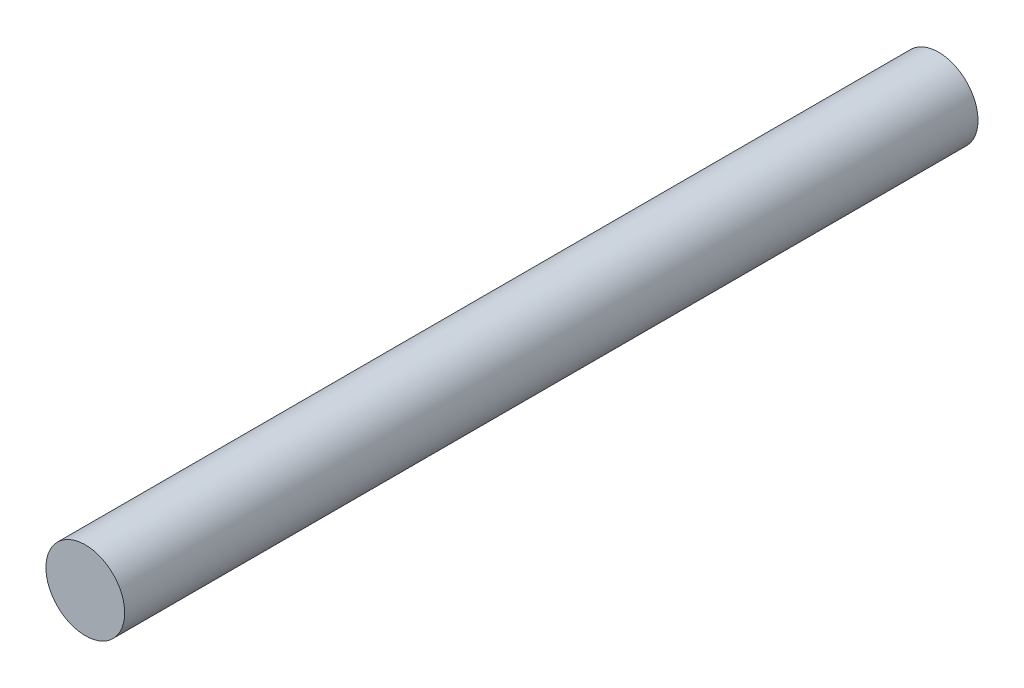
ISO-10303-21;
HEADER;
FILE_DESCRIPTION(('STEP AP214'),'2;1');
FILE_NAME('part.step','',(''),(''),'','','');
FILE_SCHEMA(('AUTOMOTIVE_DESIGN { 1 0 10303 214 1 1 1 1 }'));
ENDSEC;
DATA;
#1=APPLICATION_CONTEXT('core data for automotive mechanical design processes');
#2=APPLICATION_PROTOCOL_DEFINITION('international standard','automotive_design',2000,#1);
#3=PRODUCT_CONTEXT('',#1,'mechanical');
#4=PRODUCT('Part','Part','',(#3));
#5=PRODUCT_RELATED_PRODUCT_CATEGORY('part','',(#4));
#6=PRODUCT_DEFINITION_FORMATION('','',#4);
#7=PRODUCT_DEFINITION_CONTEXT('part definition',#1,'design');
#8=PRODUCT_DEFINITION('design','',#6,#7);
#9=PRODUCT_DEFINITION_SHAPE('','',#8);
#10=(LENGTH_UNIT() NAMED_UNIT(*) SI_UNIT(.MILLI.,.METRE.));
#11=(NAMED_UNIT(*) PLANE_ANGLE_UNIT() SI_UNIT($,.RADIAN.));
#12=(NAMED_UNIT(*) SI_UNIT($,.STERADIAN.) SOLID_ANGLE_UNIT());
#13=UNCERTAINTY_MEASURE_WITH_UNIT(LENGTH_MEASURE(1.E-05),#10,'distance_accuracy_value','');
#14=(GEOMETRIC_REPRESENTATION_CONTEXT(3) GLOBAL_UNCERTAINTY_ASSIGNED_CONTEXT((#13)) GLOBAL_UNIT_ASSIGNED_CONTEXT((#10,
#11,#12)) REPRESENTATION_CONTEXT('',''));
#15=CARTESIAN_POINT('',(0.,0.,0.));
#16=DIRECTION('',(0.,0.,1.));
#17=DIRECTION('',(1.,0.,0.));
#18=AXIS2_PLACEMENT_3D('',#15,#16,#17);
#19=CARTESIAN_POINT('',(0.,0.,130.));
#20=DIRECTION('',(0.,0.,-1.));
#21=DIRECTION('',(-1.,0.,0.));
#22=AXIS2_PLACEMENT_3D('',#19,#20,#21);
#23=CYLINDRICAL_SURFACE('',#22,6.);
#24=CARTESIAN_POINT('',(0.,0.,130.));
#25=DIRECTION('',(0.,0.,1.));
#26=DIRECTION('',(1.,0.,0.));
#27=AXIS2_PLACEMENT_3D('',#24,#25,#26);
#28=CIRCLE('',#27,6.);
#29=CARTESIAN_POINT('',(6.,0.,130.));
#30=VERTEX_POINT('',#29);
#31=EDGE_CURVE('E10',#30,#30,#28,.T.);
#32=ORIENTED_EDGE('',*,*,#31,.F.);
#33=EDGE_LOOP('',(#32));
#34=FACE_BOUND('',#33,.T.);
#35=CARTESIAN_POINT('',(0.,0.,0.));
#36=DIRECTION('',(0.,0.,1.));
#37=DIRECTION('',(1.,0.,0.));
#38=AXIS2_PLACEMENT_3D('',#35,#36,#37);
#39=CIRCLE('',#38,6.);
#40=CARTESIAN_POINT('',(6.,0.,0.));
#41=VERTEX_POINT('',#40);
#42=EDGE_CURVE('E34',#41,#41,#39,.T.);
#43=ORIENTED_EDGE('',*,*,#42,.T.);
#44=EDGE_LOOP('',(#43));
#45=FACE_BOUND('',#44,.T.);
#46=ADVANCED_FACE('F31',(#34,#45),#23,.T.);
#47=CARTESIAN_POINT('',(0.,0.,130.));
#48=DIRECTION('',(0.,0.,1.));
#49=DIRECTION('',(1.,0.,0.));
#50=AXIS2_PLACEMENT_3D('',#47,#48,#49);
#51=PLANE('',#50);
#52=ORIENTED_EDGE('',*,*,#31,.T.);
#53=EDGE_LOOP('',(#52));
#54=FACE_BOUND('',#53,.T.);
#55=ADVANCED_FACE('F46',(#54),#51,.T.);
#56=CARTESIAN_POINT('',(0.,0.,0.));
#57=DIRECTION('',(0.,0.,1.));
#58=DIRECTION('',(1.,0.,0.));
#59=AXIS2_PLACEMENT_3D('',#56,#57,#58);
#60=PLANE('',#59);
#61=ORIENTED_EDGE('',*,*,#42,.F.);
#62=EDGE_LOOP('',(#61));
#63=FACE_BOUND('',#62,.T.);
#64=ADVANCED_FACE('F44',(#63),#60,.F.);
#65=CLOSED_SHELL('',(#46,#55,#64));
#66=MANIFOLD_SOLID_BREP('B2',#65);
#67=ADVANCED_BREP_SHAPE_REPRESENTATION('',(#18,#66),#14);
#68=SHAPE_DEFINITION_REPRESENTATION(#9,#67);
ENDSEC;
END-ISO-10303-21;
